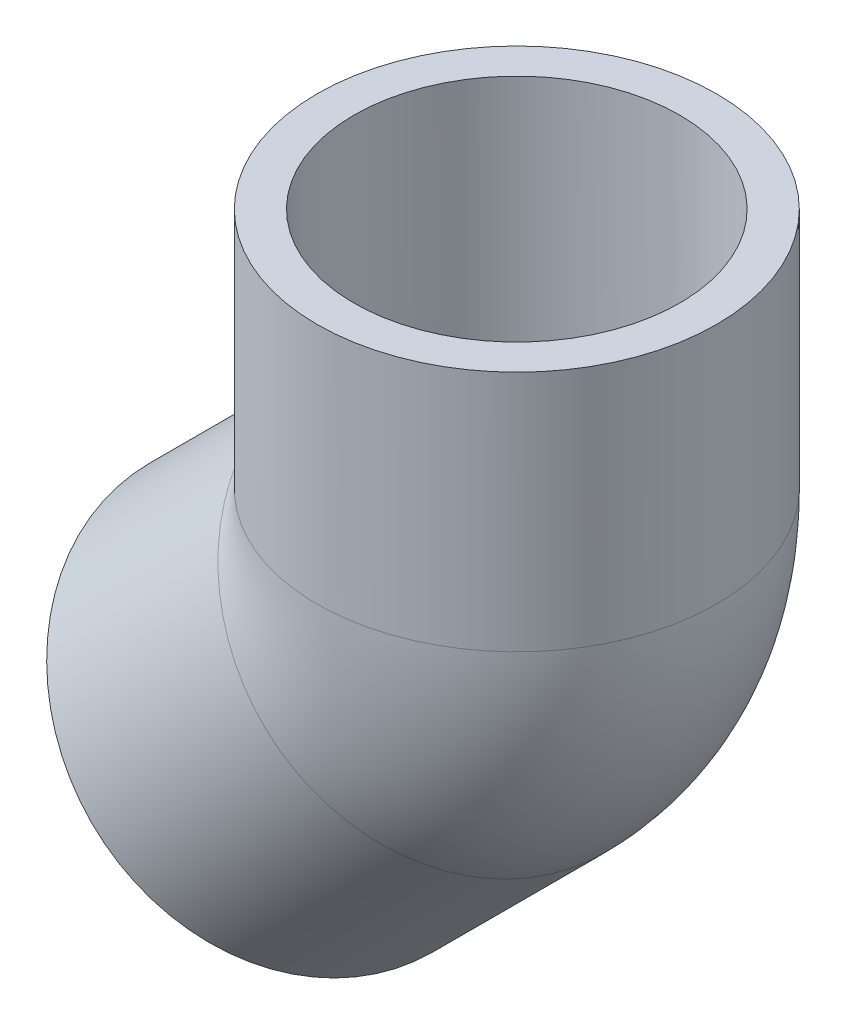
ISO-10303-21;
HEADER;
FILE_DESCRIPTION(('STEP AP214'),'2;1');
FILE_NAME('part.step','',(''),(''),'','','');
FILE_SCHEMA(('AUTOMOTIVE_DESIGN { 1 0 10303 214 1 1 1 1 }'));
ENDSEC;
DATA;
#1=APPLICATION_CONTEXT('core data for automotive mechanical design processes');
#2=APPLICATION_PROTOCOL_DEFINITION('international standard','automotive_design',2000,#1);
#3=PRODUCT_CONTEXT('',#1,'mechanical');
#4=PRODUCT('Part','Part','',(#3));
#5=PRODUCT_RELATED_PRODUCT_CATEGORY('part','',(#4));
#6=PRODUCT_DEFINITION_FORMATION('','',#4);
#7=PRODUCT_DEFINITION_CONTEXT('part definition',#1,'design');
#8=PRODUCT_DEFINITION('design','',#6,#7);
#9=PRODUCT_DEFINITION_SHAPE('','',#8);
#10=(LENGTH_UNIT() NAMED_UNIT(*) SI_UNIT(.MILLI.,.METRE.));
#11=(NAMED_UNIT(*) PLANE_ANGLE_UNIT() SI_UNIT($,.RADIAN.));
#12=(NAMED_UNIT(*) SI_UNIT($,.STERADIAN.) SOLID_ANGLE_UNIT());
#13=UNCERTAINTY_MEASURE_WITH_UNIT(LENGTH_MEASURE(1.E-05),#10,'distance_accuracy_value','');
#14=(GEOMETRIC_REPRESENTATION_CONTEXT(3) GLOBAL_UNCERTAINTY_ASSIGNED_CONTEXT((#13)) GLOBAL_UNIT_ASSIGNED_CONTEXT((#10,
#11,#12)) REPRESENTATION_CONTEXT('',''));
#15=CARTESIAN_POINT('',(0.,0.,0.));
#16=DIRECTION('',(0.,0.,1.));
#17=DIRECTION('',(1.,0.,0.));
#18=AXIS2_PLACEMENT_3D('',#15,#16,#17);
#19=CARTESIAN_POINT('',(-8.70186818131607,-37.8877005747907,0.));
#20=DIRECTION('',(-0.707106781186549,-0.707106781186546,0.));
#21=DIRECTION('',(0.707106781186546,-0.707106781186549,0.));
#22=AXIS2_PLACEMENT_3D('',#19,#20,#21);
#23=PLANE('',#22);
#24=CARTESIAN_POINT('',(-23.2947843780534,-23.2947843780533,0.));
#25=DIRECTION('',(-0.707106781186549,-0.707106781186546,0.));
#26=DIRECTION('',(0.707106781186546,-0.707106781186549,0.));
#27=AXIS2_PLACEMENT_3D('',#24,#25,#26);
#28=CIRCLE('',#27,20.6375);
#29=CARTESIAN_POINT('',(-8.70186818131607,-37.8877005747907,0.));
#30=VERTEX_POINT('',#29);
#31=EDGE_CURVE('E59',#30,#30,#28,.T.);
#32=ORIENTED_EDGE('',*,*,#31,.T.);
#33=EDGE_LOOP('',(#32));
#34=FACE_BOUND('',#33,.T.);
#35=CARTESIAN_POINT('',(-23.2947843780534,-23.2947843780533,0.));
#36=DIRECTION('',(-0.707106781186549,-0.707106781186546,0.));
#37=DIRECTION('',(0.707106781186546,-0.707106781186549,0.));
#38=AXIS2_PLACEMENT_3D('',#35,#36,#37);
#39=CIRCLE('',#38,16.8275);
#40=CARTESIAN_POINT('',(-11.3959450176368,-35.19362373847,0.));
#41=VERTEX_POINT('',#40);
#42=EDGE_CURVE('E39',#41,#41,#39,.T.);
#43=ORIENTED_EDGE('',*,*,#42,.F.);
#44=EDGE_LOOP('',(#43));
#45=FACE_BOUND('',#44,.T.);
#46=ADVANCED_FACE('F32',(#34,#45),#23,.T.);
#47=CARTESIAN_POINT('',(-5.60367981954716,-5.60367981954714,0.));
#48=DIRECTION('',(-0.707106781186549,-0.707106781186546,0.));
#49=DIRECTION('',(0.707106781186546,-0.707106781186549,0.));
#50=AXIS2_PLACEMENT_3D('',#47,#48,#49);
#51=CONICAL_SURFACE('',#50,16.637,0.00761406605526419);
#52=ORIENTED_EDGE('',*,*,#42,.T.);
#53=EDGE_LOOP('',(#52));
#54=FACE_BOUND('',#53,.T.);
#55=CARTESIAN_POINT('',(-5.60367981954716,-5.60367981954714,0.));
#56=DIRECTION('',(-0.707106781186549,-0.707106781186546,0.));
#57=DIRECTION('',(0.707106781186546,-0.707106781186549,0.));
#58=AXIS2_PLACEMENT_3D('',#55,#56,#57);
#59=CIRCLE('',#58,16.637);
#60=CARTESIAN_POINT('',(6.1604556990534,-17.3678153381477,0.));
#61=VERTEX_POINT('',#60);
#62=EDGE_CURVE('E77',#61,#61,#59,.T.);
#63=ORIENTED_EDGE('',*,*,#62,.F.);
#64=EDGE_LOOP('',(#63));
#65=FACE_BOUND('',#64,.T.);
#66=ADVANCED_FACE('F86',(#54,#65),#51,.F.);
#67=CARTESIAN_POINT('',(-23.2947843780534,-23.2947843780533,0.));
#68=DIRECTION('',(-0.707106781186549,-0.707106781186546,0.));
#69=DIRECTION('',(0.707106781186546,-0.707106781186549,0.));
#70=AXIS2_PLACEMENT_3D('',#67,#68,#69);
#71=CYLINDRICAL_SURFACE('',#70,20.6375);
#72=CARTESIAN_POINT('',(0.,0.,0.));
#73=DIRECTION('',(-0.382683432365091,-0.923879532511286,0.));
#74=DIRECTION('',(-0.923879532511286,0.382683432365091,0.));
#75=AXIS2_PLACEMENT_3D('',#72,#73,#74);
#76=ELLIPSE('',#75,22.3378690335343,20.6375);
#77=CARTESIAN_POINT('',(-19.1321596390942,7.92479999999999,-7.73736866087));
#78=VERTEX_POINT('',#77);
#79=CARTESIAN_POINT('',(-19.1321596390943,7.92479999999999,7.73736866086995));
#80=VERTEX_POINT('',#79);
#81=EDGE_CURVE('E53',#78,#80,#76,.F.);
#82=ORIENTED_EDGE('',*,*,#81,.F.);
#83=CARTESIAN_POINT('',(-5.60367981954716,-5.60367981954714,0.));
#84=DIRECTION('',(0.707106781186549,0.707106781186546,0.));
#85=DIRECTION('',(-0.707106781186546,0.707106781186549,0.));
#86=AXIS2_PLACEMENT_3D('',#83,#84,#85);
#87=CIRCLE('',#86,20.6375);
#88=EDGE_CURVE('E50',#80,#78,#87,.T.);
#89=ORIENTED_EDGE('',*,*,#88,.F.);
#90=EDGE_LOOP('',(#82,#89));
#91=FACE_BOUND('',#90,.T.);
#92=ORIENTED_EDGE('',*,*,#31,.F.);
#93=EDGE_LOOP('',(#92));
#94=FACE_BOUND('',#93,.T.);
#95=ADVANCED_FACE('F51',(#91,#94),#71,.T.);
#96=CARTESIAN_POINT('',(-5.60367981954716,-5.60367981954714,0.));
#97=DIRECTION('',(0.707106781186549,0.707106781186546,0.));
#98=DIRECTION('',(-0.707106781186546,0.707106781186549,0.));
#99=AXIS2_PLACEMENT_3D('',#96,#97,#98);
#100=PLANE('',#99);
#101=CARTESIAN_POINT('',(-5.60367981954716,-5.60367981954714,0.));
#102=DIRECTION('',(0.707106781186549,0.707106781186546,0.));
#103=DIRECTION('',(-0.707106781186546,0.707106781186549,0.));
#104=AXIS2_PLACEMENT_3D('',#101,#102,#103);
#105=CIRCLE('',#104,13.3223);
#106=CARTESIAN_POINT('',(3.81660885145435,-15.0239684905487,0.));
#107=VERTEX_POINT('',#106);
#108=EDGE_CURVE('E56',#107,#107,#105,.T.);
#109=ORIENTED_EDGE('',*,*,#108,.T.);
#110=EDGE_LOOP('',(#109));
#111=FACE_BOUND('',#110,.T.);
#112=ORIENTED_EDGE('',*,*,#62,.T.);
#113=EDGE_LOOP('',(#112));
#114=FACE_BOUND('',#113,.T.);
#115=ADVANCED_FACE('F96',(#111,#114),#100,.F.);
#116=CARTESIAN_POINT('',(-38.2643192781885,7.9248,0.));
#117=DIRECTION('',(0.,-1.,0.));
#118=DIRECTION('',(-1.,0.,0.));
#119=AXIS2_PLACEMENT_3D('',#116,#117,#118);
#120=CIRCLE('',#119,20.6375);
#121=TRIMMED_CURVE('',#120,(PARAMETER_VALUE(-2.75728441428771)),
(PARAMETER_VALUE(2.75728441428771)),.T.,.PARAMETER.);
#122=CARTESIAN_POINT('',(-19.1321596390943,7.9248,0.));
#123=DIRECTION('',(0.,0.,-1.));
#124=AXIS1_PLACEMENT('',#122,#123);
#125=SURFACE_OF_REVOLUTION('',#121,#124);
#126=ORIENTED_EDGE('',*,*,#88,.T.);
#127=CARTESIAN_POINT('',(0.,7.9248,0.));
#128=DIRECTION('',(0.,1.,0.));
#129=DIRECTION('',(-1.,0.,0.));
#130=AXIS2_PLACEMENT_3D('',#127,#128,#129);
#131=CIRCLE('',#130,20.6375);
#132=EDGE_CURVE('E45',#80,#78,#131,.T.);
#133=ORIENTED_EDGE('',*,*,#132,.F.);
#134=EDGE_LOOP('',(#126,#133));
#135=FACE_BOUND('',#134,.T.);
#136=ADVANCED_FACE('F58',(#135),#125,.T.);
#137=CARTESIAN_POINT('',(-19.1321596390943,7.9248,0.));
#138=DIRECTION('',(0.,0.,-1.));
#139=DIRECTION('',(-1.,0.,0.));
#140=AXIS2_PLACEMENT_3D('',#137,#138,#139);
#141=TOROIDAL_SURFACE('',#140,19.1321596390943,13.3223);
#142=CARTESIAN_POINT('',(0.,7.9248,0.));
#143=DIRECTION('',(0.,1.,0.));
#144=DIRECTION('',(-1.,0.,0.));
#145=AXIS2_PLACEMENT_3D('',#142,#143,#144);
#146=CIRCLE('',#145,13.3223);
#147=CARTESIAN_POINT('',(13.3223,7.9248,0.));
#148=VERTEX_POINT('',#147);
#149=EDGE_CURVE('E55',#148,#148,#146,.T.);
#150=CARTESIAN_POINT('',(-19.1321596390943,7.9248,0.));
#151=DIRECTION('',(0.,0.,-1.));
#152=DIRECTION('',(-1.,0.,0.));
#153=AXIS2_PLACEMENT_3D('',#150,#151,#152);
#154=CIRCLE('',#153,32.4544596390942);
#155=EDGE_CURVE('',#148,#107,#154,.T.);
#156=ORIENTED_EDGE('',*,*,#149,.T.);
#157=ORIENTED_EDGE('',*,*,#108,.F.);
#158=ORIENTED_EDGE('',*,*,#155,.T.);
#159=ORIENTED_EDGE('',*,*,#155,.F.);
#160=EDGE_LOOP('',(#156,#158,#157,#159));
#161=FACE_BOUND('',#160,.T.);
#162=ADVANCED_FACE('F106',(#161),#141,.F.);
#163=CARTESIAN_POINT('',(0.,7.9248,0.));
#164=DIRECTION('',(0.,1.,0.));
#165=DIRECTION('',(-1.,0.,0.));
#166=AXIS2_PLACEMENT_3D('',#163,#164,#165);
#167=PLANE('',#166);
#168=CARTESIAN_POINT('',(0.,7.9248,0.));
#169=DIRECTION('',(0.,1.,0.));
#170=DIRECTION('',(-1.,0.,0.));
#171=AXIS2_PLACEMENT_3D('',#168,#169,#170);
#172=CIRCLE('',#171,16.637);
#173=CARTESIAN_POINT('',(-16.637,7.92479999999999,0.));
#174=VERTEX_POINT('',#173);
#175=EDGE_CURVE('E11',#174,#174,#172,.F.);
#176=ORIENTED_EDGE('',*,*,#175,.F.);
#177=EDGE_LOOP('',(#176));
#178=FACE_BOUND('',#177,.T.);
#179=ORIENTED_EDGE('',*,*,#149,.F.);
#180=EDGE_LOOP('',(#179));
#181=FACE_BOUND('',#180,.T.);
#182=ADVANCED_FACE('F109',(#178,#181),#167,.T.);
#183=CARTESIAN_POINT('',(20.6375,32.9438,0.));
#184=DIRECTION('',(0.,1.,0.));
#185=DIRECTION('',(0.,0.,1.));
#186=AXIS2_PLACEMENT_3D('',#183,#184,#185);
#187=PLANE('',#186);
#188=CARTESIAN_POINT('',(0.,32.9438,0.));
#189=DIRECTION('',(0.,-1.,0.));
#190=DIRECTION('',(0.,0.,-1.));
#191=AXIS2_PLACEMENT_3D('',#188,#189,#190);
#192=CIRCLE('',#191,16.8275);
#193=CARTESIAN_POINT('',(0.,32.9438,-16.8275));
#194=VERTEX_POINT('',#193);
#195=EDGE_CURVE('E67',#194,#194,#192,.T.);
#196=ORIENTED_EDGE('',*,*,#195,.T.);
#197=EDGE_LOOP('',(#196));
#198=FACE_BOUND('',#197,.T.);
#199=CARTESIAN_POINT('',(0.,32.9438,0.));
#200=DIRECTION('',(0.,-1.,0.));
#201=DIRECTION('',(0.,0.,-1.));
#202=AXIS2_PLACEMENT_3D('',#199,#200,#201);
#203=CIRCLE('',#202,20.6375);
#204=CARTESIAN_POINT('',(0.,32.9438,-20.6375));
#205=VERTEX_POINT('',#204);
#206=EDGE_CURVE('E62',#205,#205,#203,.T.);
#207=ORIENTED_EDGE('',*,*,#206,.F.);
#208=EDGE_LOOP('',(#207));
#209=FACE_BOUND('',#208,.T.);
#210=ADVANCED_FACE('F112',(#198,#209),#187,.T.);
#211=CARTESIAN_POINT('',(0.,0.,0.));
#212=DIRECTION('',(0.,-1.,0.));
#213=DIRECTION('',(0.,0.,-1.));
#214=AXIS2_PLACEMENT_3D('',#211,#212,#213);
#215=CYLINDRICAL_SURFACE('',#214,20.6375);
#216=ORIENTED_EDGE('',*,*,#206,.T.);
#217=EDGE_LOOP('',(#216));
#218=FACE_BOUND('',#217,.T.);
#219=ORIENTED_EDGE('',*,*,#132,.T.);
#220=ORIENTED_EDGE('',*,*,#81,.T.);
#221=EDGE_LOOP('',(#219,#220));
#222=FACE_BOUND('',#221,.T.);
#223=ADVANCED_FACE('F61',(#218,#222),#215,.T.);
#224=CARTESIAN_POINT('',(0.,32.9438,0.));
#225=DIRECTION('',(0.,1.,0.));
#226=DIRECTION('',(0.,0.,1.));
#227=AXIS2_PLACEMENT_3D('',#224,#225,#226);
#228=CONICAL_SURFACE('',#227,16.8275,0.00761406605526405);
#229=ORIENTED_EDGE('',*,*,#175,.T.);
#230=EDGE_LOOP('',(#229));
#231=FACE_BOUND('',#230,.T.);
#232=ORIENTED_EDGE('',*,*,#195,.F.);
#233=EDGE_LOOP('',(#232));
#234=FACE_BOUND('',#233,.T.);
#235=ADVANCED_FACE('F120',(#231,#234),#228,.F.);
#236=CLOSED_SHELL('',(#46,#66,#95,#115,#136,#162,#182,#210,#223,#235));
#237=MANIFOLD_SOLID_BREP('B2',#236);
#238=ADVANCED_BREP_SHAPE_REPRESENTATION('',(#18,#237),#14);
#239=SHAPE_DEFINITION_REPRESENTATION(#9,#238);
ENDSEC;
END-ISO-10303-21;
